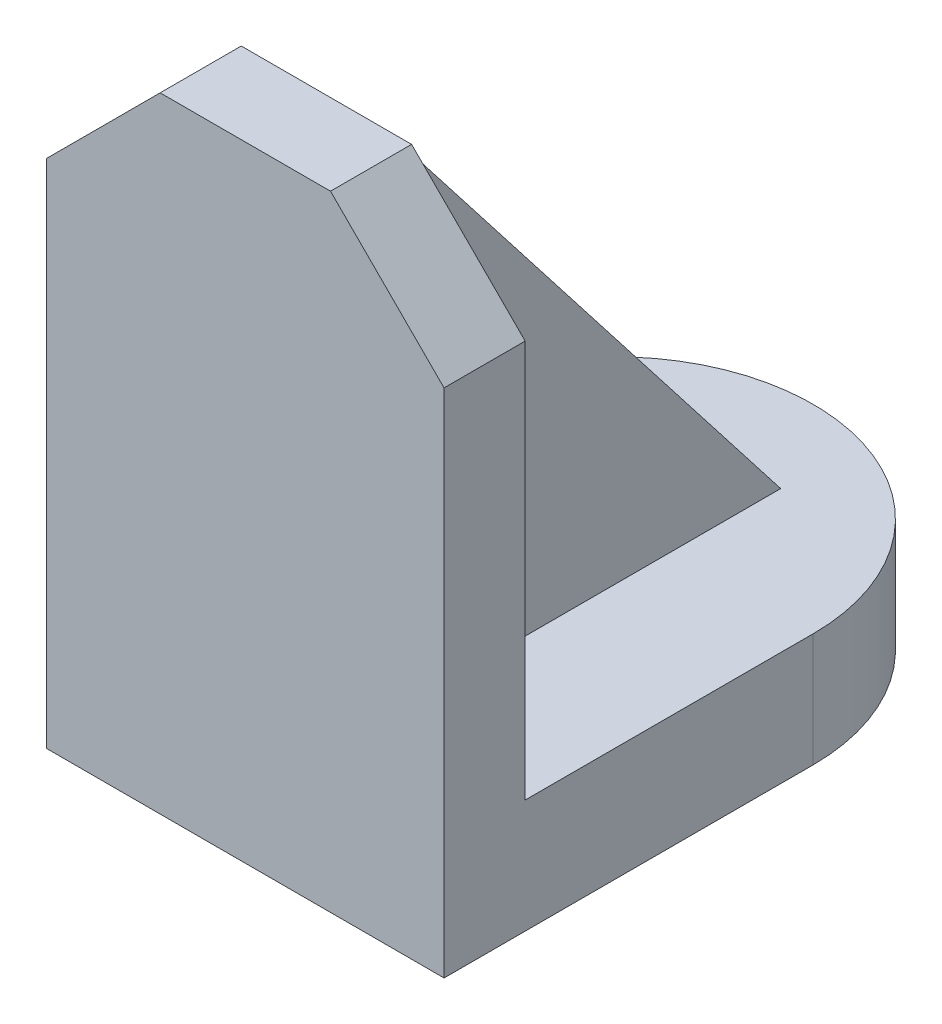
ISO-10303-21;
HEADER;
FILE_DESCRIPTION(('STEP AP214'),'2;1');
FILE_NAME('part.step','',(''),(''),'','','');
FILE_SCHEMA(('AUTOMOTIVE_DESIGN { 1 0 10303 214 1 1 1 1 }'));
ENDSEC;
DATA;
#1=APPLICATION_CONTEXT('core data for automotive mechanical design processes');
#2=APPLICATION_PROTOCOL_DEFINITION('international standard','automotive_design',2000,#1);
#3=PRODUCT_CONTEXT('',#1,'mechanical');
#4=PRODUCT('Part','Part','',(#3));
#5=PRODUCT_RELATED_PRODUCT_CATEGORY('part','',(#4));
#6=PRODUCT_DEFINITION_FORMATION('','',#4);
#7=PRODUCT_DEFINITION_CONTEXT('part definition',#1,'design');
#8=PRODUCT_DEFINITION('design','',#6,#7);
#9=PRODUCT_DEFINITION_SHAPE('','',#8);
#10=(LENGTH_UNIT() NAMED_UNIT(*) SI_UNIT(.MILLI.,.METRE.));
#11=(NAMED_UNIT(*) PLANE_ANGLE_UNIT() SI_UNIT($,.RADIAN.));
#12=(NAMED_UNIT(*) SI_UNIT($,.STERADIAN.) SOLID_ANGLE_UNIT());
#13=UNCERTAINTY_MEASURE_WITH_UNIT(LENGTH_MEASURE(1.E-05),#10,'distance_accuracy_value','');
#14=(GEOMETRIC_REPRESENTATION_CONTEXT(3) GLOBAL_UNCERTAINTY_ASSIGNED_CONTEXT((#13)) GLOBAL_UNIT_ASSIGNED_CONTEXT((#10,
#11,#12)) REPRESENTATION_CONTEXT('',''));
#15=CARTESIAN_POINT('',(0.,0.,0.));
#16=DIRECTION('',(0.,0.,1.));
#17=DIRECTION('',(1.,0.,0.));
#18=AXIS2_PLACEMENT_3D('',#15,#16,#17);
#19=CARTESIAN_POINT('',(0.,12.,0.));
#20=DIRECTION('',(0.,1.,0.));
#21=DIRECTION('',(0.,0.,1.));
#22=AXIS2_PLACEMENT_3D('',#19,#20,#21);
#23=PLANE('',#22);
#24=DIRECTION('',(-1.,0.,0.));
#25=VECTOR('',#24,1.);
#26=CARTESIAN_POINT('',(6.,12.,-31.0705113722252));
#27=LINE('',#26,#25);
#28=CARTESIAN_POINT('',(6.,12.,-31.0705113722252));
#29=VERTEX_POINT('',#28);
#30=CARTESIAN_POINT('',(-6.,12.,-31.0705113722252));
#31=VERTEX_POINT('',#30);
#32=EDGE_CURVE('E132',#29,#31,#27,.T.);
#33=ORIENTED_EDGE('',*,*,#32,.F.);
#34=DIRECTION('',(0.,0.,-1.));
#35=VECTOR('',#34,1.);
#36=CARTESIAN_POINT('',(6.,12.,10.9294886277748));
#37=LINE('',#36,#35);
#38=CARTESIAN_POINT('',(6.,12.,10.9294886277748));
#39=VERTEX_POINT('',#38);
#40=EDGE_CURVE('E122',#39,#29,#37,.T.);
#41=ORIENTED_EDGE('',*,*,#40,.F.);
#42=DIRECTION('',(-1.,0.,0.));
#43=VECTOR('',#42,1.);
#44=CARTESIAN_POINT('',(-21.,12.,10.9294886277748));
#45=LINE('',#44,#43);
#46=CARTESIAN_POINT('',(21.,12.,10.9294886277748));
#47=VERTEX_POINT('',#46);
#48=EDGE_CURVE('E140',#47,#39,#45,.T.);
#49=ORIENTED_EDGE('',*,*,#48,.F.);
#50=DIRECTION('',(0.,0.,-1.));
#51=VECTOR('',#50,1.);
#52=CARTESIAN_POINT('',(21.,12.,0.));
#53=LINE('',#52,#51);
#54=CARTESIAN_POINT('',(21.,12.,-19.5));
#55=VERTEX_POINT('',#54);
#56=EDGE_CURVE('E161',#47,#55,#53,.T.);
#57=ORIENTED_EDGE('',*,*,#56,.T.);
#58=CARTESIAN_POINT('',(0.,12.,-19.5));
#59=DIRECTION('',(0.,1.,0.));
#60=DIRECTION('',(0.,0.,1.));
#61=AXIS2_PLACEMENT_3D('',#58,#59,#60);
#62=CIRCLE('',#61,21.);
#63=CARTESIAN_POINT('',(-21.,12.,-19.5));
#64=VERTEX_POINT('',#63);
#65=EDGE_CURVE('E164',#64,#55,#62,.F.);
#66=ORIENTED_EDGE('',*,*,#65,.F.);
#67=DIRECTION('',(0.,0.,-1.));
#68=VECTOR('',#67,1.);
#69=CARTESIAN_POINT('',(-21.,12.,0.));
#70=LINE('',#69,#68);
#71=CARTESIAN_POINT('',(-21.,12.,10.9294886277748));
#72=VERTEX_POINT('',#71);
#73=EDGE_CURVE('E159',#72,#64,#70,.T.);
#74=ORIENTED_EDGE('',*,*,#73,.F.);
#75=CARTESIAN_POINT('',(-6.,12.,10.9294886277748));
#76=VERTEX_POINT('',#75);
#77=EDGE_CURVE('E131',#76,#72,#45,.T.);
#78=ORIENTED_EDGE('',*,*,#77,.F.);
#79=DIRECTION('',(0.,0.,-1.));
#80=VECTOR('',#79,1.);
#81=CARTESIAN_POINT('',(-6.,12.,10.9294886277748));
#82=LINE('',#81,#80);
#83=EDGE_CURVE('E124',#76,#31,#82,.T.);
#84=ORIENTED_EDGE('',*,*,#83,.T.);
#85=EDGE_LOOP('',(#33,#41,#49,#57,#66,#74,#78,#84));
#86=FACE_BOUND('',#85,.T.);
#87=ADVANCED_FACE('F35',(#86),#23,.T.);
#88=CARTESIAN_POINT('',(-21.,66.,10.9294886277748));
#89=DIRECTION('',(0.,0.,1.));
#90=DIRECTION('',(1.,0.,0.));
#91=AXIS2_PLACEMENT_3D('',#88,#89,#90);
#92=PLANE('',#91);
#93=DIRECTION('',(0.,-1.,0.));
#94=VECTOR('',#93,1.);
#95=CARTESIAN_POINT('',(6.,66.,10.9294886277748));
#96=LINE('',#95,#94);
#97=CARTESIAN_POINT('',(6.,66.,10.9294886277748));
#98=VERTEX_POINT('',#97);
#99=EDGE_CURVE('E120',#98,#39,#96,.T.);
#100=ORIENTED_EDGE('',*,*,#99,.F.);
#101=DIRECTION('',(-1.,0.,0.));
#102=VECTOR('',#101,1.);
#103=CARTESIAN_POINT('',(-21.,66.,10.9294886277748));
#104=LINE('',#103,#102);
#105=CARTESIAN_POINT('',(8.99999999999995,66.,10.9294886277748));
#106=VERTEX_POINT('',#105);
#107=EDGE_CURVE('E138',#106,#98,#104,.T.);
#108=ORIENTED_EDGE('',*,*,#107,.F.);
#109=DIRECTION('',(-0.707106781186548,0.707106781186548,0.));
#110=VECTOR('',#109,1.);
#111=CARTESIAN_POINT('',(8.99999999999996,66.,10.9294886277748));
#112=LINE('',#111,#110);
#113=CARTESIAN_POINT('',(21.,54.,10.9294886277748));
#114=VERTEX_POINT('',#113);
#115=EDGE_CURVE('E192',#106,#114,#112,.F.);
#116=ORIENTED_EDGE('',*,*,#115,.T.);
#117=DIRECTION('',(0.,-1.,0.));
#118=VECTOR('',#117,1.);
#119=CARTESIAN_POINT('',(21.,66.,10.9294886277748));
#120=LINE('',#119,#118);
#121=EDGE_CURVE('E151',#114,#47,#120,.T.);
#122=ORIENTED_EDGE('',*,*,#121,.T.);
#123=ORIENTED_EDGE('',*,*,#48,.T.);
#124=EDGE_LOOP('',(#100,#108,#116,#122,#123));
#125=FACE_BOUND('',#124,.T.);
#126=ADVANCED_FACE('F137',(#125),#92,.F.);
#127=CARTESIAN_POINT('',(-21.,12.,0.));
#128=DIRECTION('',(-1.,0.,0.));
#129=DIRECTION('',(0.,0.,1.));
#130=AXIS2_PLACEMENT_3D('',#127,#128,#129);
#131=PLANE('',#130);
#132=DIRECTION('',(0.,-1.,0.));
#133=VECTOR('',#132,1.);
#134=CARTESIAN_POINT('',(-21.,12.,19.5));
#135=LINE('',#134,#133);
#136=CARTESIAN_POINT('',(-21.,54.,19.5));
#137=VERTEX_POINT('',#136);
#138=CARTESIAN_POINT('',(-21.,0.,19.5));
#139=VERTEX_POINT('',#138);
#140=EDGE_CURVE('E183',#137,#139,#135,.T.);
#141=ORIENTED_EDGE('',*,*,#140,.F.);
#142=DIRECTION('',(0.,0.,-1.));
#143=VECTOR('',#142,1.);
#144=CARTESIAN_POINT('',(-21.,54.,10.9294886277748));
#145=LINE('',#144,#143);
#146=CARTESIAN_POINT('',(-21.,54.,10.9294886277748));
#147=VERTEX_POINT('',#146);
#148=EDGE_CURVE('E11',#137,#147,#145,.T.);
#149=ORIENTED_EDGE('',*,*,#148,.T.);
#150=DIRECTION('',(0.,-1.,0.));
#151=VECTOR('',#150,1.);
#152=CARTESIAN_POINT('',(-21.,66.,10.9294886277748));
#153=LINE('',#152,#151);
#154=EDGE_CURVE('E147',#147,#72,#153,.T.);
#155=ORIENTED_EDGE('',*,*,#154,.T.);
#156=ORIENTED_EDGE('',*,*,#73,.T.);
#157=DIRECTION('',(0.,-1.,0.));
#158=VECTOR('',#157,1.);
#159=CARTESIAN_POINT('',(-21.,12.,-19.5));
#160=LINE('',#159,#158);
#161=CARTESIAN_POINT('',(-21.,0.,-19.5));
#162=VERTEX_POINT('',#161);
#163=EDGE_CURVE('E167',#64,#162,#160,.T.);
#164=ORIENTED_EDGE('',*,*,#163,.T.);
#165=DIRECTION('',(0.,0.,-1.));
#166=VECTOR('',#165,1.);
#167=CARTESIAN_POINT('',(-21.,0.,0.));
#168=LINE('',#167,#166);
#169=EDGE_CURVE('E158',#139,#162,#168,.T.);
#170=ORIENTED_EDGE('',*,*,#169,.F.);
#171=EDGE_LOOP('',(#141,#149,#155,#156,#164,#170));
#172=FACE_BOUND('',#171,.T.);
#173=ADVANCED_FACE('F231',(#172),#131,.T.);
#174=CARTESIAN_POINT('',(0.,12.,19.5));
#175=DIRECTION('',(0.,0.,1.));
#176=DIRECTION('',(1.,0.,0.));
#177=AXIS2_PLACEMENT_3D('',#174,#175,#176);
#178=PLANE('',#177);
#179=DIRECTION('',(0.,-1.,0.));
#180=VECTOR('',#179,1.);
#181=CARTESIAN_POINT('',(21.,12.,19.5));
#182=LINE('',#181,#180);
#183=CARTESIAN_POINT('',(21.,54.,19.5));
#184=VERTEX_POINT('',#183);
#185=CARTESIAN_POINT('',(21.,0.,19.5));
#186=VERTEX_POINT('',#185);
#187=EDGE_CURVE('E181',#184,#186,#182,.T.);
#188=ORIENTED_EDGE('',*,*,#187,.F.);
#189=DIRECTION('',(0.707106781186548,-0.707106781186548,0.));
#190=VECTOR('',#189,1.);
#191=CARTESIAN_POINT('',(31.5,43.5,19.5));
#192=LINE('',#191,#190);
#193=CARTESIAN_POINT('',(8.99999999999995,66.,19.5));
#194=VERTEX_POINT('',#193);
#195=EDGE_CURVE('E43',#184,#194,#192,.F.);
#196=ORIENTED_EDGE('',*,*,#195,.T.);
#197=DIRECTION('',(1.,0.,0.));
#198=VECTOR('',#197,1.);
#199=CARTESIAN_POINT('',(-21.,66.,19.5));
#200=LINE('',#199,#198);
#201=CARTESIAN_POINT('',(-8.99999999999994,66.,19.5));
#202=VERTEX_POINT('',#201);
#203=EDGE_CURVE('E153',#202,#194,#200,.T.);
#204=ORIENTED_EDGE('',*,*,#203,.F.);
#205=DIRECTION('',(-0.707106781186548,-0.707106781186548,0.));
#206=VECTOR('',#205,1.);
#207=CARTESIAN_POINT('',(-31.5,43.5,19.5));
#208=LINE('',#207,#206);
#209=EDGE_CURVE('E58',#202,#137,#208,.T.);
#210=ORIENTED_EDGE('',*,*,#209,.T.);
#211=ORIENTED_EDGE('',*,*,#140,.T.);
#212=DIRECTION('',(-1.,0.,0.));
#213=VECTOR('',#212,1.);
#214=CARTESIAN_POINT('',(0.,0.,19.5));
#215=LINE('',#214,#213);
#216=EDGE_CURVE('E170',#186,#139,#215,.T.);
#217=ORIENTED_EDGE('',*,*,#216,.F.);
#218=EDGE_LOOP('',(#188,#196,#204,#210,#211,#217));
#219=FACE_BOUND('',#218,.T.);
#220=ADVANCED_FACE('F198',(#219),#178,.T.);
#221=CARTESIAN_POINT('',(21.,12.,0.));
#222=DIRECTION('',(-1.,0.,0.));
#223=DIRECTION('',(0.,0.,1.));
#224=AXIS2_PLACEMENT_3D('',#221,#222,#223);
#225=PLANE('',#224);
#226=ORIENTED_EDGE('',*,*,#121,.F.);
#227=DIRECTION('',(0.,0.,1.));
#228=VECTOR('',#227,1.);
#229=CARTESIAN_POINT('',(21.,54.,0.));
#230=LINE('',#229,#228);
#231=EDGE_CURVE('E194',#114,#184,#230,.T.);
#232=ORIENTED_EDGE('',*,*,#231,.T.);
#233=ORIENTED_EDGE('',*,*,#187,.T.);
#234=DIRECTION('',(0.,0.,-1.));
#235=VECTOR('',#234,1.);
#236=CARTESIAN_POINT('',(21.,0.,0.));
#237=LINE('',#236,#235);
#238=CARTESIAN_POINT('',(21.,0.,-19.5));
#239=VERTEX_POINT('',#238);
#240=EDGE_CURVE('E173',#186,#239,#237,.T.);
#241=ORIENTED_EDGE('',*,*,#240,.T.);
#242=DIRECTION('',(0.,-1.,0.));
#243=VECTOR('',#242,1.);
#244=CARTESIAN_POINT('',(21.,12.,-19.5));
#245=LINE('',#244,#243);
#246=EDGE_CURVE('E179',#55,#239,#245,.T.);
#247=ORIENTED_EDGE('',*,*,#246,.F.);
#248=ORIENTED_EDGE('',*,*,#56,.F.);
#249=EDGE_LOOP('',(#226,#232,#233,#241,#247,#248));
#250=FACE_BOUND('',#249,.T.);
#251=ADVANCED_FACE('F207',(#250),#225,.F.);
#252=CARTESIAN_POINT('',(0.,12.,-19.5));
#253=DIRECTION('',(0.,-1.,0.));
#254=DIRECTION('',(0.,0.,-1.));
#255=AXIS2_PLACEMENT_3D('',#252,#253,#254);
#256=CYLINDRICAL_SURFACE('',#255,21.);
#257=CARTESIAN_POINT('',(0.,0.,-19.5));
#258=DIRECTION('',(0.,1.,0.));
#259=DIRECTION('',(0.,0.,1.));
#260=AXIS2_PLACEMENT_3D('',#257,#258,#259);
#261=CIRCLE('',#260,21.);
#262=EDGE_CURVE('E162',#162,#239,#261,.F.);
#263=ORIENTED_EDGE('',*,*,#262,.F.);
#264=ORIENTED_EDGE('',*,*,#163,.F.);
#265=ORIENTED_EDGE('',*,*,#65,.T.);
#266=ORIENTED_EDGE('',*,*,#246,.T.);
#267=EDGE_LOOP('',(#263,#264,#265,#266));
#268=FACE_BOUND('',#267,.T.);
#269=ADVANCED_FACE('F239',(#268),#256,.T.);
#270=CARTESIAN_POINT('',(0.,0.,0.));
#271=DIRECTION('',(0.,1.,0.));
#272=DIRECTION('',(0.,0.,1.));
#273=AXIS2_PLACEMENT_3D('',#270,#271,#272);
#274=PLANE('',#273);
#275=ORIENTED_EDGE('',*,*,#169,.T.);
#276=ORIENTED_EDGE('',*,*,#262,.T.);
#277=ORIENTED_EDGE('',*,*,#240,.F.);
#278=ORIENTED_EDGE('',*,*,#216,.T.);
#279=EDGE_LOOP('',(#275,#276,#277,#278));
#280=FACE_BOUND('',#279,.T.);
#281=ADVANCED_FACE('F235',(#280),#274,.F.);
#282=CARTESIAN_POINT('',(-6.,66.,10.9294886277748));
#283=VERTEX_POINT('',#282);
#284=CARTESIAN_POINT('',(-8.99999999999994,66.,10.9294886277748));
#285=VERTEX_POINT('',#284);
#286=EDGE_CURVE('E148',#283,#285,#104,.T.);
#287=ORIENTED_EDGE('',*,*,#286,.F.);
#288=DIRECTION('',(0.,-1.,0.));
#289=VECTOR('',#288,1.);
#290=CARTESIAN_POINT('',(-6.,66.,10.9294886277748));
#291=LINE('',#290,#289);
#292=EDGE_CURVE('E217',#283,#76,#291,.T.);
#293=ORIENTED_EDGE('',*,*,#292,.T.);
#294=ORIENTED_EDGE('',*,*,#77,.T.);
#295=ORIENTED_EDGE('',*,*,#154,.F.);
#296=DIRECTION('',(0.707106781186548,0.707106781186548,0.));
#297=VECTOR('',#296,1.);
#298=CARTESIAN_POINT('',(-8.99999999999994,66.,10.9294886277748));
#299=LINE('',#298,#297);
#300=EDGE_CURVE('E189',#147,#285,#299,.T.);
#301=ORIENTED_EDGE('',*,*,#300,.T.);
#302=EDGE_LOOP('',(#287,#293,#294,#295,#301));
#303=FACE_BOUND('',#302,.T.);
#304=ADVANCED_FACE('F225',(#303),#92,.F.);
#305=CARTESIAN_POINT('',(0.,66.,0.));
#306=DIRECTION('',(0.,-1.,0.));
#307=DIRECTION('',(0.,0.,-1.));
#308=AXIS2_PLACEMENT_3D('',#305,#306,#307);
#309=PLANE('',#308);
#310=ORIENTED_EDGE('',*,*,#203,.T.);
#311=DIRECTION('',(0.,0.,-1.));
#312=VECTOR('',#311,1.);
#313=CARTESIAN_POINT('',(8.99999999999996,66.,0.));
#314=LINE('',#313,#312);
#315=EDGE_CURVE('E146',#194,#106,#314,.T.);
#316=ORIENTED_EDGE('',*,*,#315,.T.);
#317=ORIENTED_EDGE('',*,*,#107,.T.);
#318=DIRECTION('',(-1.,0.,0.));
#319=VECTOR('',#318,1.);
#320=CARTESIAN_POINT('',(6.,66.,10.9294886277748));
#321=LINE('',#320,#319);
#322=EDGE_CURVE('E127',#98,#283,#321,.T.);
#323=ORIENTED_EDGE('',*,*,#322,.T.);
#324=ORIENTED_EDGE('',*,*,#286,.T.);
#325=DIRECTION('',(0.,0.,1.));
#326=VECTOR('',#325,1.);
#327=CARTESIAN_POINT('',(-8.99999999999994,66.,19.5));
#328=LINE('',#327,#326);
#329=EDGE_CURVE('E185',#285,#202,#328,.T.);
#330=ORIENTED_EDGE('',*,*,#329,.T.);
#331=EDGE_LOOP('',(#310,#316,#317,#323,#324,#330));
#332=FACE_BOUND('',#331,.T.);
#333=ADVANCED_FACE('F144',(#332),#309,.F.);
#334=CARTESIAN_POINT('',(8.99999999999996,66.,0.));
#335=DIRECTION('',(-0.707106781186547,-0.707106781186547,0.));
#336=DIRECTION('',(0.,0.,-1.));
#337=AXIS2_PLACEMENT_3D('',#334,#335,#336);
#338=PLANE('',#337);
#339=ORIENTED_EDGE('',*,*,#195,.F.);
#340=ORIENTED_EDGE('',*,*,#231,.F.);
#341=ORIENTED_EDGE('',*,*,#115,.F.);
#342=ORIENTED_EDGE('',*,*,#315,.F.);
#343=EDGE_LOOP('',(#339,#340,#341,#342));
#344=FACE_BOUND('',#343,.T.);
#345=ADVANCED_FACE('F203',(#344),#338,.F.);
#346=CARTESIAN_POINT('',(-8.99999999999994,66.,0.));
#347=DIRECTION('',(-0.707106781186547,0.707106781186547,0.));
#348=DIRECTION('',(0.,0.,-1.));
#349=AXIS2_PLACEMENT_3D('',#346,#347,#348);
#350=PLANE('',#349);
#351=ORIENTED_EDGE('',*,*,#300,.F.);
#352=ORIENTED_EDGE('',*,*,#148,.F.);
#353=ORIENTED_EDGE('',*,*,#209,.F.);
#354=ORIENTED_EDGE('',*,*,#329,.F.);
#355=EDGE_LOOP('',(#351,#352,#353,#354));
#356=FACE_BOUND('',#355,.T.);
#357=ADVANCED_FACE('F37',(#356),#350,.T.);
#358=CARTESIAN_POINT('',(6.,12.,-31.0705113722252));
#359=DIRECTION('',(0.,-0.613940613514921,0.789352217376326));
#360=DIRECTION('',(0.,-0.789352217376326,-0.613940613514921));
#361=AXIS2_PLACEMENT_3D('',#358,#359,#360);
#362=PLANE('',#361);
#363=DIRECTION('',(0.,0.789352217376326,0.61394061351492));
#364=VECTOR('',#363,1.);
#365=CARTESIAN_POINT('',(-6.,12.,-31.0705113722252));
#366=LINE('',#365,#364);
#367=EDGE_CURVE('E50',#31,#283,#366,.T.);
#368=ORIENTED_EDGE('',*,*,#367,.T.);
#369=ORIENTED_EDGE('',*,*,#322,.F.);
#370=DIRECTION('',(0.,0.789352217376326,0.61394061351492));
#371=VECTOR('',#370,1.);
#372=CARTESIAN_POINT('',(6.,12.,-31.0705113722252));
#373=LINE('',#372,#371);
#374=EDGE_CURVE('E117',#29,#98,#373,.T.);
#375=ORIENTED_EDGE('',*,*,#374,.F.);
#376=ORIENTED_EDGE('',*,*,#32,.T.);
#377=EDGE_LOOP('',(#368,#369,#375,#376));
#378=FACE_BOUND('',#377,.T.);
#379=ADVANCED_FACE('F128',(#378),#362,.F.);
#380=CARTESIAN_POINT('',(6.,0.,0.));
#381=DIRECTION('',(-1.,0.,0.));
#382=DIRECTION('',(0.,0.,1.));
#383=AXIS2_PLACEMENT_3D('',#380,#381,#382);
#384=PLANE('',#383);
#385=ORIENTED_EDGE('',*,*,#374,.T.);
#386=ORIENTED_EDGE('',*,*,#99,.T.);
#387=ORIENTED_EDGE('',*,*,#40,.T.);
#388=EDGE_LOOP('',(#385,#386,#387));
#389=FACE_BOUND('',#388,.T.);
#390=ADVANCED_FACE('F118',(#389),#384,.F.);
#391=CARTESIAN_POINT('',(-6.,0.,0.));
#392=DIRECTION('',(-1.,0.,0.));
#393=DIRECTION('',(0.,0.,1.));
#394=AXIS2_PLACEMENT_3D('',#391,#392,#393);
#395=PLANE('',#394);
#396=ORIENTED_EDGE('',*,*,#367,.F.);
#397=ORIENTED_EDGE('',*,*,#83,.F.);
#398=ORIENTED_EDGE('',*,*,#292,.F.);
#399=EDGE_LOOP('',(#396,#397,#398));
#400=FACE_BOUND('',#399,.T.);
#401=ADVANCED_FACE('F222',(#400),#395,.T.);
#402=CLOSED_SHELL('',(#87,#126,#173,#220,#251,#269,#281,#304,#333,#345,#357,#379,#390,#401));
#403=MANIFOLD_SOLID_BREP('B2',#402);
#404=ADVANCED_BREP_SHAPE_REPRESENTATION('',(#18,#403),#14);
#405=SHAPE_DEFINITION_REPRESENTATION(#9,#404);
ENDSEC;
END-ISO-10303-21;
